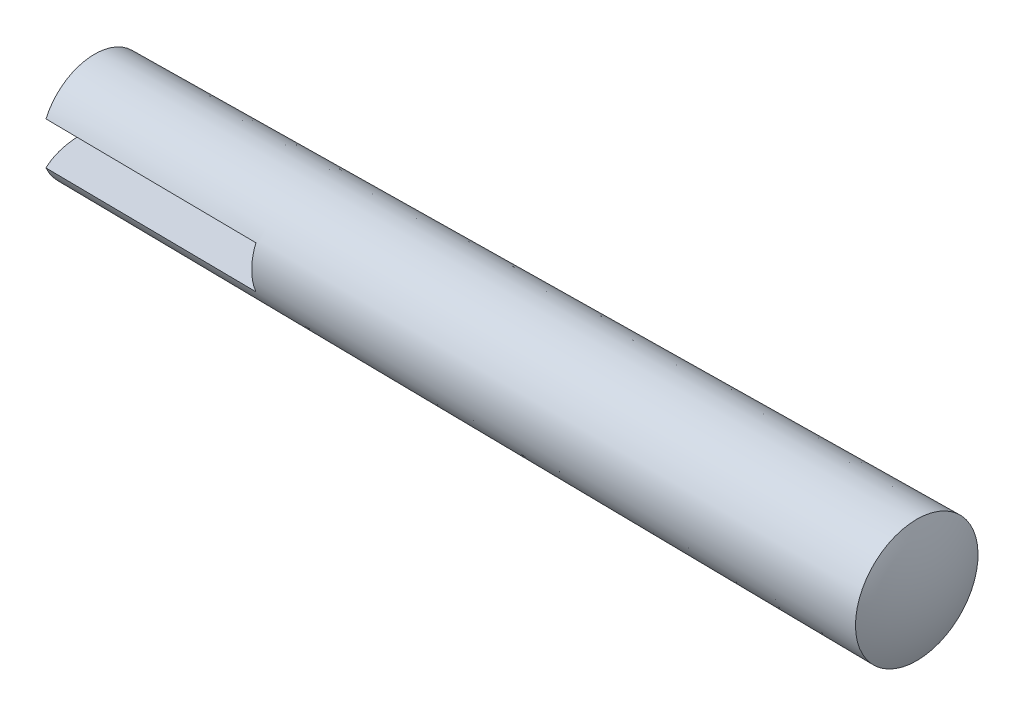
ISO-10303-21;
HEADER;
FILE_DESCRIPTION(('STEP AP214'),'2;1');
FILE_NAME('part.step','',(''),(''),'','','');
FILE_SCHEMA(('AUTOMOTIVE_DESIGN { 1 0 10303 214 1 1 1 1 }'));
ENDSEC;
DATA;
#1=APPLICATION_CONTEXT('core data for automotive mechanical design processes');
#2=APPLICATION_PROTOCOL_DEFINITION('international standard','automotive_design',2000,#1);
#3=PRODUCT_CONTEXT('',#1,'mechanical');
#4=PRODUCT('Part','Part','',(#3));
#5=PRODUCT_RELATED_PRODUCT_CATEGORY('part','',(#4));
#6=PRODUCT_DEFINITION_FORMATION('','',#4);
#7=PRODUCT_DEFINITION_CONTEXT('part definition',#1,'design');
#8=PRODUCT_DEFINITION('design','',#6,#7);
#9=PRODUCT_DEFINITION_SHAPE('','',#8);
#10=(LENGTH_UNIT() NAMED_UNIT(*) SI_UNIT(.MILLI.,.METRE.));
#11=(NAMED_UNIT(*) PLANE_ANGLE_UNIT() SI_UNIT($,.RADIAN.));
#12=(NAMED_UNIT(*) SI_UNIT($,.STERADIAN.) SOLID_ANGLE_UNIT());
#13=UNCERTAINTY_MEASURE_WITH_UNIT(LENGTH_MEASURE(1.E-05),#10,'distance_accuracy_value','');
#14=(GEOMETRIC_REPRESENTATION_CONTEXT(3) GLOBAL_UNCERTAINTY_ASSIGNED_CONTEXT((#13)) GLOBAL_UNIT_ASSIGNED_CONTEXT((#10,
#11,#12)) REPRESENTATION_CONTEXT('',''));
#15=CARTESIAN_POINT('',(0.,0.,0.));
#16=DIRECTION('',(0.,0.,1.));
#17=DIRECTION('',(1.,0.,0.));
#18=AXIS2_PLACEMENT_3D('',#15,#16,#17);
#19=CARTESIAN_POINT('',(5.27531746031746,0.,0.));
#20=DIRECTION('',(-1.,0.,0.));
#21=DIRECTION('',(0.,1.,0.));
#22=AXIS2_PLACEMENT_3D('',#19,#20,#21);
#23=SPHERICAL_SURFACE('',#22,5.27531746031746);
#24=CARTESIAN_POINT('',(0.63,0.,0.));
#25=DIRECTION('',(-1.,0.,0.));
#26=DIRECTION('',(0.,0.,1.));
#27=AXIS2_PLACEMENT_3D('',#24,#25,#26);
#28=CIRCLE('',#27,2.5);
#29=CARTESIAN_POINT('',(0.629999999999997,1.,2.29128784747801));
#30=VERTEX_POINT('',#29);
#31=CARTESIAN_POINT('',(0.63,1.,-2.29128784747792));
#32=VERTEX_POINT('',#31);
#33=EDGE_CURVE('E117',#30,#32,#28,.T.);
#34=ORIENTED_EDGE('',*,*,#33,.T.);
#35=CARTESIAN_POINT('',(5.27531746031746,1.,0.));
#36=DIRECTION('',(0.,1.,0.));
#37=DIRECTION('',(0.,0.,1.));
#38=AXIS2_PLACEMENT_3D('',#35,#36,#37);
#39=CIRCLE('',#38,5.1796693241104);
#40=EDGE_CURVE('E60',#32,#30,#39,.T.);
#41=ORIENTED_EDGE('',*,*,#40,.T.);
#42=EDGE_LOOP('',(#34,#41));
#43=FACE_BOUND('',#42,.T.);
#44=ADVANCED_FACE('F32',(#43),#23,.T.);
#45=CARTESIAN_POINT('',(33.068270827515,0.,0.));
#46=DIRECTION('',(-1.,0.,0.));
#47=DIRECTION('',(0.,1.,0.));
#48=AXIS2_PLACEMENT_3D('',#45,#46,#47);
#49=SPHERICAL_SURFACE('',#48,6.93172917248503);
#50=CARTESIAN_POINT('',(39.37,0.,0.));
#51=DIRECTION('',(-1.,0.,0.));
#52=DIRECTION('',(0.,0.,1.));
#53=AXIS2_PLACEMENT_3D('',#50,#51,#52);
#54=CIRCLE('',#53,2.88739999953784);
#55=CARTESIAN_POINT('',(39.37,0.,2.88739999953784));
#56=VERTEX_POINT('',#55);
#57=EDGE_CURVE('E120',#56,#56,#54,.T.);
#58=ORIENTED_EDGE('',*,*,#57,.F.);
#59=EDGE_LOOP('',(#58));
#60=FACE_BOUND('',#59,.T.);
#61=ADVANCED_FACE('F34',(#60),#49,.T.);
#62=CARTESIAN_POINT('',(0.63,-1.,-2.29128784747792));
#63=VERTEX_POINT('',#62);
#64=CARTESIAN_POINT('',(0.629999999999997,-1.,2.29128784747801));
#65=VERTEX_POINT('',#64);
#66=EDGE_CURVE('E96',#63,#65,#28,.T.);
#67=ORIENTED_EDGE('',*,*,#66,.T.);
#68=CARTESIAN_POINT('',(5.27531746031746,-1.,0.));
#69=DIRECTION('',(0.,-1.,0.));
#70=DIRECTION('',(0.,0.,-1.));
#71=AXIS2_PLACEMENT_3D('',#68,#69,#70);
#72=CIRCLE('',#71,5.1796693241104);
#73=EDGE_CURVE('E124',#65,#63,#72,.T.);
#74=ORIENTED_EDGE('',*,*,#73,.T.);
#75=EDGE_LOOP('',(#67,#74));
#76=FACE_BOUND('',#75,.T.);
#77=ADVANCED_FACE('F130',(#76),#23,.T.);
#78=CARTESIAN_POINT('',(39.37,0.,0.));
#79=DIRECTION('',(1.,0.,0.));
#80=DIRECTION('',(0.,0.,-1.));
#81=AXIS2_PLACEMENT_3D('',#78,#79,#80);
#82=CONICAL_SURFACE('',#81,2.88739999953784,0.00999966667473662);
#83=CARTESIAN_POINT('',(10.63,0.,0.));
#84=DIRECTION('',(-1.,0.,0.));
#85=DIRECTION('',(0.,0.,1.));
#86=AXIS2_PLACEMENT_3D('',#83,#84,#85);
#87=CIRCLE('',#86,2.5999999998807);
#88=CARTESIAN_POINT('',(10.63,1.,-2.39999999987076));
#89=VERTEX_POINT('',#88);
#90=CARTESIAN_POINT('',(10.63,-1.,-2.39999999987076));
#91=VERTEX_POINT('',#90);
#92=EDGE_CURVE('E76',#89,#91,#87,.T.);
#93=ORIENTED_EDGE('',*,*,#92,.F.);
#94=CARTESIAN_POINT('',(-3.70900834535417,1.,-2.24386547777016));
#95=CARTESIAN_POINT('',(-2.05482586272696,1.,-2.26197544587343));
#96=CARTESIAN_POINT('',(-0.400642986896072,1.,-2.28004944914037));
#97=CARTESIAN_POINT('',(2.90772350274027,1.,-2.31612978718371));
#98=CARTESIAN_POINT('',(4.56190711654571,1.,-2.33413612196011));
#99=CARTESIAN_POINT('',(12.8328269244239,1.,-2.42400927773406));
#100=CARTESIAN_POINT('',(19.4495682905486,1.,-2.49540054392162));
#101=CARTESIAN_POINT('',(26.0663136247212,1.,-2.56642090948581));
#102=B_SPLINE_CURVE_WITH_KNOTS('',3,(#94,#95,#96,#97,#98,#99,#100,#101),.UNSPECIFIED.,.F.,.F.,
(4,2,2,4),(0.,4.96284483914642,9.92568967819504,29.7770690788931),.UNSPECIFIED.);
#103=EDGE_CURVE('E11',#89,#32,#102,.F.);
#104=ORIENTED_EDGE('',*,*,#103,.T.);
#105=ORIENTED_EDGE('',*,*,#33,.F.);
#106=CARTESIAN_POINT('',(-3.70900834535417,1.,2.24386547777016));
#107=CARTESIAN_POINT('',(-2.05482586272697,1.,2.26197544587343));
#108=CARTESIAN_POINT('',(-0.400642986896075,1.,2.28004944914037));
#109=CARTESIAN_POINT('',(2.90772350274026,1.,2.31612978718371));
#110=CARTESIAN_POINT('',(4.56190711654571,1.,2.33413612196011));
#111=CARTESIAN_POINT('',(12.8328269244239,1.,2.42400927773406));
#112=CARTESIAN_POINT('',(19.4495682905486,1.,2.49540054392162));
#113=CARTESIAN_POINT('',(26.0663136247212,1.,2.56642090948581));
#114=B_SPLINE_CURVE_WITH_KNOTS('',3,(#106,#107,#108,#109,#110,#111,#112,#113),.UNSPECIFIED.,.F.,
.F.,(4,2,2,4),(0.,4.96284483914642,9.92568967819504,29.7770690788931),.UNSPECIFIED.);
#115=CARTESIAN_POINT('',(10.63,1.,2.39999999987076));
#116=VERTEX_POINT('',#115);
#117=EDGE_CURVE('E82',#30,#116,#114,.T.);
#118=ORIENTED_EDGE('',*,*,#117,.T.);
#119=CARTESIAN_POINT('',(10.63,-1.,2.39999999987076));
#120=VERTEX_POINT('',#119);
#121=EDGE_CURVE('E84',#120,#116,#87,.T.);
#122=ORIENTED_EDGE('',*,*,#121,.F.);
#123=CARTESIAN_POINT('',(-3.70900834535417,-1.,2.24386547777016));
#124=CARTESIAN_POINT('',(-2.05482586272697,-1.,2.26197544587343));
#125=CARTESIAN_POINT('',(-0.400642986896075,-1.,2.28004944914037));
#126=CARTESIAN_POINT('',(2.90772350274026,-1.,2.31612978718371));
#127=CARTESIAN_POINT('',(4.56190711654571,-1.,2.33413612196011));
#128=CARTESIAN_POINT('',(12.8328269244239,-1.,2.42400927773406));
#129=CARTESIAN_POINT('',(19.4495682905486,-1.,2.49540054392162));
#130=CARTESIAN_POINT('',(26.0663136247212,-1.,2.56642090948581));
#131=B_SPLINE_CURVE_WITH_KNOTS('',3,(#123,#124,#125,#126,#127,#128,#129,#130),.UNSPECIFIED.,.F.,
.F.,(4,2,2,4),(0.,4.96284483914642,9.92568967819504,29.7770690788931),.UNSPECIFIED.);
#132=EDGE_CURVE('E89',#120,#65,#131,.F.);
#133=ORIENTED_EDGE('',*,*,#132,.T.);
#134=ORIENTED_EDGE('',*,*,#66,.F.);
#135=CARTESIAN_POINT('',(-3.70900834535417,-1.,-2.24386547777016));
#136=CARTESIAN_POINT('',(-2.05482586272696,-1.,-2.26197544587343));
#137=CARTESIAN_POINT('',(-0.400642986896072,-1.,-2.28004944914037));
#138=CARTESIAN_POINT('',(2.90772350274027,-1.,-2.31612978718371));
#139=CARTESIAN_POINT('',(4.56190711654571,-1.,-2.33413612196011));
#140=CARTESIAN_POINT('',(12.8328269244239,-1.,-2.42400927773406));
#141=CARTESIAN_POINT('',(19.4495682905486,-1.,-2.49540054392162));
#142=CARTESIAN_POINT('',(26.0663136247212,-1.,-2.56642090948581));
#143=B_SPLINE_CURVE_WITH_KNOTS('',3,(#135,#136,#137,#138,#139,#140,#141,#142),.UNSPECIFIED.,.F.,
.F.,(4,2,2,4),(0.,4.96284483914642,9.92568967819504,29.7770690788931),.UNSPECIFIED.);
#144=EDGE_CURVE('E45',#63,#91,#143,.T.);
#145=ORIENTED_EDGE('',*,*,#144,.T.);
#146=EDGE_LOOP('',(#93,#104,#105,#118,#122,#133,#134,#145));
#147=FACE_BOUND('',#146,.T.);
#148=ORIENTED_EDGE('',*,*,#57,.T.);
#149=EDGE_LOOP('',(#148));
#150=FACE_BOUND('',#149,.T.);
#151=ADVANCED_FACE('F93',(#147,#150),#82,.T.);
#152=CARTESIAN_POINT('',(0.,1.,2.88739999953783));
#153=DIRECTION('',(0.,1.,0.));
#154=DIRECTION('',(0.,0.,1.));
#155=AXIS2_PLACEMENT_3D('',#152,#153,#154);
#156=PLANE('',#155);
#157=DIRECTION('',(0.,0.,1.));
#158=VECTOR('',#157,1.);
#159=CARTESIAN_POINT('',(10.63,1.,2.88739999953783));
#160=LINE('',#159,#158);
#161=EDGE_CURVE('E79',#89,#116,#160,.T.);
#162=ORIENTED_EDGE('',*,*,#161,.T.);
#163=ORIENTED_EDGE('',*,*,#117,.F.);
#164=ORIENTED_EDGE('',*,*,#40,.F.);
#165=ORIENTED_EDGE('',*,*,#103,.F.);
#166=EDGE_LOOP('',(#162,#163,#164,#165));
#167=FACE_BOUND('',#166,.T.);
#168=ADVANCED_FACE('F109',(#167),#156,.F.);
#169=CARTESIAN_POINT('',(0.,-1.,2.88739999953783));
#170=DIRECTION('',(0.,-1.,0.));
#171=DIRECTION('',(0.,0.,-1.));
#172=AXIS2_PLACEMENT_3D('',#169,#170,#171);
#173=PLANE('',#172);
#174=ORIENTED_EDGE('',*,*,#73,.F.);
#175=ORIENTED_EDGE('',*,*,#132,.F.);
#176=DIRECTION('',(0.,0.,-1.));
#177=VECTOR('',#176,1.);
#178=CARTESIAN_POINT('',(10.63,-1.,2.88739999953783));
#179=LINE('',#178,#177);
#180=EDGE_CURVE('E52',#120,#91,#179,.T.);
#181=ORIENTED_EDGE('',*,*,#180,.T.);
#182=ORIENTED_EDGE('',*,*,#144,.F.);
#183=EDGE_LOOP('',(#174,#175,#181,#182));
#184=FACE_BOUND('',#183,.T.);
#185=ADVANCED_FACE('F86',(#184),#173,.F.);
#186=CARTESIAN_POINT('',(10.63,1.,2.88739999953783));
#187=DIRECTION('',(-1.,0.,0.));
#188=DIRECTION('',(0.,0.,1.));
#189=AXIS2_PLACEMENT_3D('',#186,#187,#188);
#190=PLANE('',#189);
#191=ORIENTED_EDGE('',*,*,#92,.T.);
#192=ORIENTED_EDGE('',*,*,#180,.F.);
#193=ORIENTED_EDGE('',*,*,#121,.T.);
#194=ORIENTED_EDGE('',*,*,#161,.F.);
#195=EDGE_LOOP('',(#191,#192,#193,#194));
#196=FACE_BOUND('',#195,.T.);
#197=ADVANCED_FACE('F77',(#196),#190,.T.);
#198=CLOSED_SHELL('',(#44,#61,#77,#151,#168,#185,#197));
#199=MANIFOLD_SOLID_BREP('B2',#198);
#200=ADVANCED_BREP_SHAPE_REPRESENTATION('',(#18,#199),#14);
#201=SHAPE_DEFINITION_REPRESENTATION(#9,#200);
ENDSEC;
END-ISO-10303-21;
